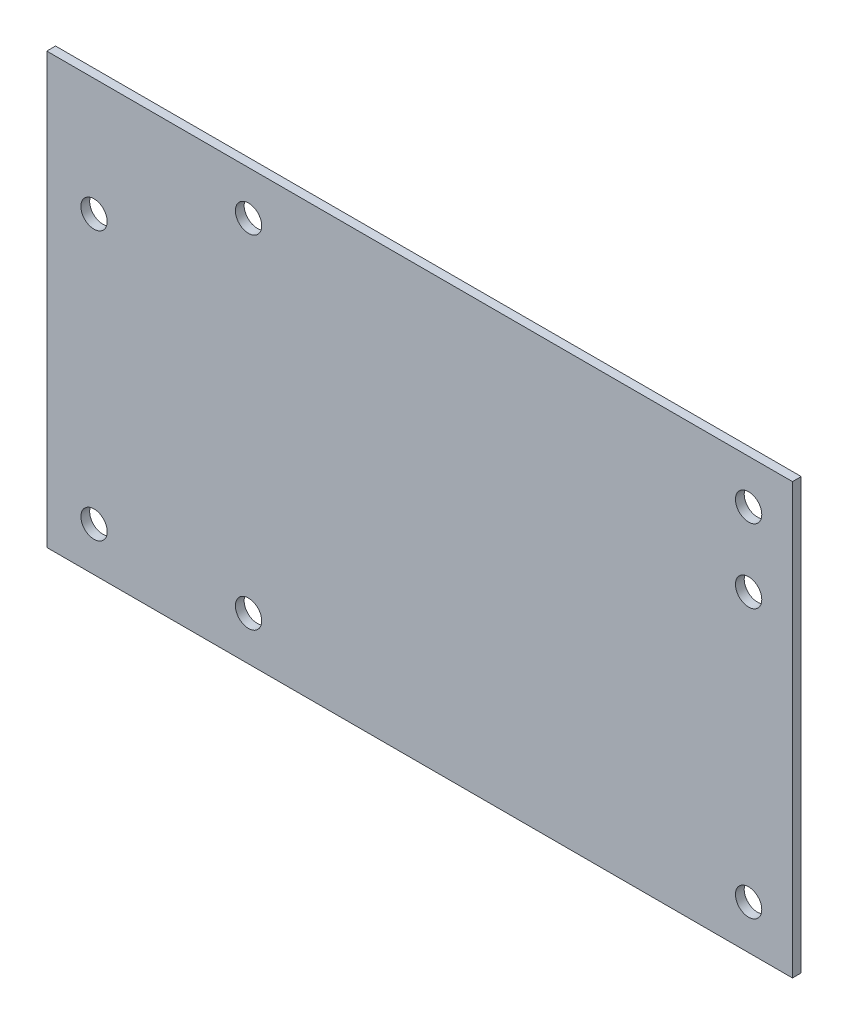
ISO-10303-21;
HEADER;
FILE_DESCRIPTION(('STEP AP214'),'2;1');
FILE_NAME('part.step','',(''),(''),'','','');
FILE_SCHEMA(('AUTOMOTIVE_DESIGN { 1 0 10303 214 1 1 1 1 }'));
ENDSEC;
DATA;
#1=APPLICATION_CONTEXT('core data for automotive mechanical design processes');
#2=APPLICATION_PROTOCOL_DEFINITION('international standard','automotive_design',2000,#1);
#3=PRODUCT_CONTEXT('',#1,'mechanical');
#4=PRODUCT('Part','Part','',(#3));
#5=PRODUCT_RELATED_PRODUCT_CATEGORY('part','',(#4));
#6=PRODUCT_DEFINITION_FORMATION('','',#4);
#7=PRODUCT_DEFINITION_CONTEXT('part definition',#1,'design');
#8=PRODUCT_DEFINITION('design','',#6,#7);
#9=PRODUCT_DEFINITION_SHAPE('','',#8);
#10=(LENGTH_UNIT() NAMED_UNIT(*) SI_UNIT(.MILLI.,.METRE.));
#11=(NAMED_UNIT(*) PLANE_ANGLE_UNIT() SI_UNIT($,.RADIAN.));
#12=(NAMED_UNIT(*) SI_UNIT($,.STERADIAN.) SOLID_ANGLE_UNIT());
#13=UNCERTAINTY_MEASURE_WITH_UNIT(LENGTH_MEASURE(1.E-05),#10,'distance_accuracy_value','');
#14=(GEOMETRIC_REPRESENTATION_CONTEXT(3) GLOBAL_UNCERTAINTY_ASSIGNED_CONTEXT((#13)) GLOBAL_UNIT_ASSIGNED_CONTEXT((#10,
#11,#12)) REPRESENTATION_CONTEXT('',''));
#15=CARTESIAN_POINT('',(0.,0.,0.));
#16=DIRECTION('',(0.,0.,1.));
#17=DIRECTION('',(1.,0.,0.));
#18=AXIS2_PLACEMENT_3D('',#15,#16,#17);
#19=CARTESIAN_POINT('',(0.,0.,1.));
#20=DIRECTION('',(0.,0.,1.));
#21=DIRECTION('',(1.,0.,0.));
#22=AXIS2_PLACEMENT_3D('',#19,#20,#21);
#23=PLANE('',#22);
#24=CARTESIAN_POINT('',(-79.61,4.99999999999998,1.));
#25=DIRECTION('',(0.,0.,1.));
#26=DIRECTION('',(1.,0.,0.));
#27=AXIS2_PLACEMENT_3D('',#24,#25,#26);
#28=CIRCLE('',#27,1.49999999999998);
#29=CARTESIAN_POINT('',(-78.11,4.99999999999998,1.));
#30=VERTEX_POINT('',#29);
#31=EDGE_CURVE('E139',#30,#30,#28,.T.);
#32=ORIENTED_EDGE('',*,*,#31,.F.);
#33=EDGE_LOOP('',(#32));
#34=FACE_BOUND('',#33,.T.);
#35=CARTESIAN_POINT('',(-79.61,35.61,1.));
#36=DIRECTION('',(0.,0.,1.));
#37=DIRECTION('',(1.,0.,0.));
#38=AXIS2_PLACEMENT_3D('',#35,#36,#37);
#39=CIRCLE('',#38,1.5);
#40=CARTESIAN_POINT('',(-78.11,35.61,1.));
#41=VERTEX_POINT('',#40);
#42=EDGE_CURVE('E127',#41,#41,#39,.T.);
#43=ORIENTED_EDGE('',*,*,#42,.F.);
#44=EDGE_LOOP('',(#43));
#45=FACE_BOUND('',#44,.T.);
#46=CARTESIAN_POINT('',(-62.,44.,1.));
#47=DIRECTION('',(0.,0.,1.));
#48=DIRECTION('',(1.,0.,0.));
#49=AXIS2_PLACEMENT_3D('',#46,#47,#48);
#50=CIRCLE('',#49,1.5);
#51=CARTESIAN_POINT('',(-60.5,44.,1.));
#52=VERTEX_POINT('',#51);
#53=EDGE_CURVE('E115',#52,#52,#50,.T.);
#54=ORIENTED_EDGE('',*,*,#53,.F.);
#55=EDGE_LOOP('',(#54));
#56=FACE_BOUND('',#55,.T.);
#57=DIRECTION('',(0.,1.,0.));
#58=VECTOR('',#57,1.);
#59=CARTESIAN_POINT('',(0.,0.,1.));
#60=LINE('',#59,#58);
#61=CARTESIAN_POINT('',(0.,0.,1.));
#62=VERTEX_POINT('',#61);
#63=CARTESIAN_POINT('',(0.,49.,1.));
#64=VERTEX_POINT('',#63);
#65=EDGE_CURVE('E85',#62,#64,#60,.T.);
#66=ORIENTED_EDGE('',*,*,#65,.T.);
#67=DIRECTION('',(-1.,0.,0.));
#68=VECTOR('',#67,1.);
#69=CARTESIAN_POINT('',(0.,49.,1.));
#70=LINE('',#69,#68);
#71=CARTESIAN_POINT('',(-85.,49.,1.));
#72=VERTEX_POINT('',#71);
#73=EDGE_CURVE('E80',#64,#72,#70,.T.);
#74=ORIENTED_EDGE('',*,*,#73,.T.);
#75=DIRECTION('',(0.,-1.,0.));
#76=VECTOR('',#75,1.);
#77=CARTESIAN_POINT('',(-85.,0.,1.));
#78=LINE('',#77,#76);
#79=CARTESIAN_POINT('',(-85.,0.,1.));
#80=VERTEX_POINT('',#79);
#81=EDGE_CURVE('E83',#72,#80,#78,.T.);
#82=ORIENTED_EDGE('',*,*,#81,.T.);
#83=DIRECTION('',(1.,0.,0.));
#84=VECTOR('',#83,1.);
#85=CARTESIAN_POINT('',(0.,0.,1.));
#86=LINE('',#85,#84);
#87=EDGE_CURVE('E50',#80,#62,#86,.T.);
#88=ORIENTED_EDGE('',*,*,#87,.T.);
#89=EDGE_LOOP('',(#66,#74,#82,#88));
#90=FACE_BOUND('',#89,.T.);
#91=CARTESIAN_POINT('',(-5.,5.,1.));
#92=DIRECTION('',(0.,0.,1.));
#93=DIRECTION('',(1.,0.,0.));
#94=AXIS2_PLACEMENT_3D('',#91,#92,#93);
#95=CIRCLE('',#94,1.5);
#96=CARTESIAN_POINT('',(-3.5,5.,1.));
#97=VERTEX_POINT('',#96);
#98=EDGE_CURVE('E100',#97,#97,#95,.T.);
#99=ORIENTED_EDGE('',*,*,#98,.F.);
#100=EDGE_LOOP('',(#99));
#101=FACE_BOUND('',#100,.T.);
#102=CARTESIAN_POINT('',(-4.99999999999998,35.61,1.));
#103=DIRECTION('',(0.,0.,1.));
#104=DIRECTION('',(1.,0.,0.));
#105=AXIS2_PLACEMENT_3D('',#102,#103,#104);
#106=CIRCLE('',#105,1.5);
#107=CARTESIAN_POINT('',(-3.49999999999998,35.61,1.));
#108=VERTEX_POINT('',#107);
#109=EDGE_CURVE('E121',#108,#108,#106,.T.);
#110=ORIENTED_EDGE('',*,*,#109,.F.);
#111=EDGE_LOOP('',(#110));
#112=FACE_BOUND('',#111,.T.);
#113=CARTESIAN_POINT('',(-62.,4.99999999999999,1.));
#114=DIRECTION('',(0.,0.,1.));
#115=DIRECTION('',(1.,0.,0.));
#116=AXIS2_PLACEMENT_3D('',#113,#114,#115);
#117=CIRCLE('',#116,1.5);
#118=CARTESIAN_POINT('',(-60.5,4.99999999999999,1.));
#119=VERTEX_POINT('',#118);
#120=EDGE_CURVE('E133',#119,#119,#117,.T.);
#121=ORIENTED_EDGE('',*,*,#120,.F.);
#122=EDGE_LOOP('',(#121));
#123=FACE_BOUND('',#122,.T.);
#124=CARTESIAN_POINT('',(-5.,44.,1.));
#125=DIRECTION('',(0.,0.,1.));
#126=DIRECTION('',(1.,0.,0.));
#127=AXIS2_PLACEMENT_3D('',#124,#125,#126);
#128=CIRCLE('',#127,1.5);
#129=CARTESIAN_POINT('',(-3.5,44.,1.));
#130=VERTEX_POINT('',#129);
#131=EDGE_CURVE('E145',#130,#130,#128,.T.);
#132=ORIENTED_EDGE('',*,*,#131,.F.);
#133=EDGE_LOOP('',(#132));
#134=FACE_BOUND('',#133,.T.);
#135=ADVANCED_FACE('F33',(#34,#45,#56,#90,#101,#112,#123,#134),#23,.T.);
#136=CARTESIAN_POINT('',(0.,0.,0.));
#137=DIRECTION('',(0.,0.,1.));
#138=DIRECTION('',(1.,0.,0.));
#139=AXIS2_PLACEMENT_3D('',#136,#137,#138);
#140=PLANE('',#139);
#141=DIRECTION('',(0.,1.,0.));
#142=VECTOR('',#141,1.);
#143=CARTESIAN_POINT('',(0.,0.,0.));
#144=LINE('',#143,#142);
#145=CARTESIAN_POINT('',(0.,0.,0.));
#146=VERTEX_POINT('',#145);
#147=CARTESIAN_POINT('',(0.,49.,0.));
#148=VERTEX_POINT('',#147);
#149=EDGE_CURVE('E97',#146,#148,#144,.T.);
#150=ORIENTED_EDGE('',*,*,#149,.F.);
#151=DIRECTION('',(1.,0.,0.));
#152=VECTOR('',#151,1.);
#153=CARTESIAN_POINT('',(0.,0.,0.));
#154=LINE('',#153,#152);
#155=CARTESIAN_POINT('',(-85.,0.,0.));
#156=VERTEX_POINT('',#155);
#157=EDGE_CURVE('E73',#156,#146,#154,.T.);
#158=ORIENTED_EDGE('',*,*,#157,.F.);
#159=DIRECTION('',(0.,-1.,0.));
#160=VECTOR('',#159,1.);
#161=CARTESIAN_POINT('',(-85.,0.,0.));
#162=LINE('',#161,#160);
#163=CARTESIAN_POINT('',(-85.,49.,0.));
#164=VERTEX_POINT('',#163);
#165=EDGE_CURVE('E67',#164,#156,#162,.T.);
#166=ORIENTED_EDGE('',*,*,#165,.F.);
#167=DIRECTION('',(-1.,0.,0.));
#168=VECTOR('',#167,1.);
#169=CARTESIAN_POINT('',(0.,49.,0.));
#170=LINE('',#169,#168);
#171=EDGE_CURVE('E89',#148,#164,#170,.T.);
#172=ORIENTED_EDGE('',*,*,#171,.F.);
#173=EDGE_LOOP('',(#150,#158,#166,#172));
#174=FACE_BOUND('',#173,.T.);
#175=CARTESIAN_POINT('',(-5.,5.,0.));
#176=DIRECTION('',(0.,0.,1.));
#177=DIRECTION('',(1.,0.,0.));
#178=AXIS2_PLACEMENT_3D('',#175,#176,#177);
#179=CIRCLE('',#178,1.5);
#180=CARTESIAN_POINT('',(-3.5,5.,0.));
#181=VERTEX_POINT('',#180);
#182=EDGE_CURVE('E112',#181,#181,#179,.T.);
#183=ORIENTED_EDGE('',*,*,#182,.T.);
#184=EDGE_LOOP('',(#183));
#185=FACE_BOUND('',#184,.T.);
#186=CARTESIAN_POINT('',(-62.,44.,0.));
#187=DIRECTION('',(0.,0.,1.));
#188=DIRECTION('',(1.,0.,0.));
#189=AXIS2_PLACEMENT_3D('',#186,#187,#188);
#190=CIRCLE('',#189,1.5);
#191=CARTESIAN_POINT('',(-60.5,44.,0.));
#192=VERTEX_POINT('',#191);
#193=EDGE_CURVE('E118',#192,#192,#190,.T.);
#194=ORIENTED_EDGE('',*,*,#193,.T.);
#195=EDGE_LOOP('',(#194));
#196=FACE_BOUND('',#195,.T.);
#197=CARTESIAN_POINT('',(-4.99999999999998,35.61,0.));
#198=DIRECTION('',(0.,0.,1.));
#199=DIRECTION('',(1.,0.,0.));
#200=AXIS2_PLACEMENT_3D('',#197,#198,#199);
#201=CIRCLE('',#200,1.5);
#202=CARTESIAN_POINT('',(-3.49999999999998,35.61,0.));
#203=VERTEX_POINT('',#202);
#204=EDGE_CURVE('E124',#203,#203,#201,.T.);
#205=ORIENTED_EDGE('',*,*,#204,.T.);
#206=EDGE_LOOP('',(#205));
#207=FACE_BOUND('',#206,.T.);
#208=CARTESIAN_POINT('',(-79.61,35.61,0.));
#209=DIRECTION('',(0.,0.,1.));
#210=DIRECTION('',(1.,0.,0.));
#211=AXIS2_PLACEMENT_3D('',#208,#209,#210);
#212=CIRCLE('',#211,1.5);
#213=CARTESIAN_POINT('',(-78.11,35.61,0.));
#214=VERTEX_POINT('',#213);
#215=EDGE_CURVE('E130',#214,#214,#212,.T.);
#216=ORIENTED_EDGE('',*,*,#215,.T.);
#217=EDGE_LOOP('',(#216));
#218=FACE_BOUND('',#217,.T.);
#219=CARTESIAN_POINT('',(-62.,4.99999999999999,0.));
#220=DIRECTION('',(0.,0.,1.));
#221=DIRECTION('',(1.,0.,0.));
#222=AXIS2_PLACEMENT_3D('',#219,#220,#221);
#223=CIRCLE('',#222,1.5);
#224=CARTESIAN_POINT('',(-60.5,4.99999999999999,0.));
#225=VERTEX_POINT('',#224);
#226=EDGE_CURVE('E136',#225,#225,#223,.T.);
#227=ORIENTED_EDGE('',*,*,#226,.T.);
#228=EDGE_LOOP('',(#227));
#229=FACE_BOUND('',#228,.T.);
#230=CARTESIAN_POINT('',(-79.61,4.99999999999998,0.));
#231=DIRECTION('',(0.,0.,1.));
#232=DIRECTION('',(1.,0.,0.));
#233=AXIS2_PLACEMENT_3D('',#230,#231,#232);
#234=CIRCLE('',#233,1.49999999999998);
#235=CARTESIAN_POINT('',(-78.11,4.99999999999998,0.));
#236=VERTEX_POINT('',#235);
#237=EDGE_CURVE('E142',#236,#236,#234,.T.);
#238=ORIENTED_EDGE('',*,*,#237,.T.);
#239=EDGE_LOOP('',(#238));
#240=FACE_BOUND('',#239,.T.);
#241=CARTESIAN_POINT('',(-5.,44.,0.));
#242=DIRECTION('',(0.,0.,1.));
#243=DIRECTION('',(1.,0.,0.));
#244=AXIS2_PLACEMENT_3D('',#241,#242,#243);
#245=CIRCLE('',#244,1.5);
#246=CARTESIAN_POINT('',(-3.5,44.,0.));
#247=VERTEX_POINT('',#246);
#248=EDGE_CURVE('E148',#247,#247,#245,.T.);
#249=ORIENTED_EDGE('',*,*,#248,.T.);
#250=EDGE_LOOP('',(#249));
#251=FACE_BOUND('',#250,.T.);
#252=ADVANCED_FACE('F108',(#174,#185,#196,#207,#218,#229,#240,#251),#140,.F.);
#253=CARTESIAN_POINT('',(0.,0.,1.));
#254=DIRECTION('',(-1.,0.,0.));
#255=DIRECTION('',(0.,0.,1.));
#256=AXIS2_PLACEMENT_3D('',#253,#254,#255);
#257=PLANE('',#256);
#258=ORIENTED_EDGE('',*,*,#149,.T.);
#259=DIRECTION('',(0.,0.,-1.));
#260=VECTOR('',#259,1.);
#261=CARTESIAN_POINT('',(0.,49.,1.));
#262=LINE('',#261,#260);
#263=EDGE_CURVE('E11',#64,#148,#262,.T.);
#264=ORIENTED_EDGE('',*,*,#263,.F.);
#265=ORIENTED_EDGE('',*,*,#65,.F.);
#266=DIRECTION('',(0.,0.,-1.));
#267=VECTOR('',#266,1.);
#268=CARTESIAN_POINT('',(0.,0.,1.));
#269=LINE('',#268,#267);
#270=EDGE_CURVE('E93',#62,#146,#269,.T.);
#271=ORIENTED_EDGE('',*,*,#270,.T.);
#272=EDGE_LOOP('',(#258,#264,#265,#271));
#273=FACE_BOUND('',#272,.T.);
#274=ADVANCED_FACE('F35',(#273),#257,.F.);
#275=CARTESIAN_POINT('',(0.,49.,1.));
#276=DIRECTION('',(0.,-1.,0.));
#277=DIRECTION('',(1.,0.,0.));
#278=AXIS2_PLACEMENT_3D('',#275,#276,#277);
#279=PLANE('',#278);
#280=ORIENTED_EDGE('',*,*,#171,.T.);
#281=DIRECTION('',(0.,0.,-1.));
#282=VECTOR('',#281,1.);
#283=CARTESIAN_POINT('',(-85.,49.,1.));
#284=LINE('',#283,#282);
#285=EDGE_CURVE('E42',#72,#164,#284,.T.);
#286=ORIENTED_EDGE('',*,*,#285,.F.);
#287=ORIENTED_EDGE('',*,*,#73,.F.);
#288=ORIENTED_EDGE('',*,*,#263,.T.);
#289=EDGE_LOOP('',(#280,#286,#287,#288));
#290=FACE_BOUND('',#289,.T.);
#291=ADVANCED_FACE('F88',(#290),#279,.F.);
#292=CARTESIAN_POINT('',(-85.,0.,1.));
#293=DIRECTION('',(1.,0.,0.));
#294=DIRECTION('',(0.,0.,-1.));
#295=AXIS2_PLACEMENT_3D('',#292,#293,#294);
#296=PLANE('',#295);
#297=ORIENTED_EDGE('',*,*,#165,.T.);
#298=DIRECTION('',(0.,0.,-1.));
#299=VECTOR('',#298,1.);
#300=CARTESIAN_POINT('',(-85.,0.,1.));
#301=LINE('',#300,#299);
#302=EDGE_CURVE('E90',#80,#156,#301,.T.);
#303=ORIENTED_EDGE('',*,*,#302,.F.);
#304=ORIENTED_EDGE('',*,*,#81,.F.);
#305=ORIENTED_EDGE('',*,*,#285,.T.);
#306=EDGE_LOOP('',(#297,#303,#304,#305));
#307=FACE_BOUND('',#306,.T.);
#308=ADVANCED_FACE('F91',(#307),#296,.F.);
#309=CARTESIAN_POINT('',(0.,0.,1.));
#310=DIRECTION('',(0.,1.,0.));
#311=DIRECTION('',(-1.,0.,0.));
#312=AXIS2_PLACEMENT_3D('',#309,#310,#311);
#313=PLANE('',#312);
#314=ORIENTED_EDGE('',*,*,#157,.T.);
#315=ORIENTED_EDGE('',*,*,#270,.F.);
#316=ORIENTED_EDGE('',*,*,#87,.F.);
#317=ORIENTED_EDGE('',*,*,#302,.T.);
#318=EDGE_LOOP('',(#314,#315,#316,#317));
#319=FACE_BOUND('',#318,.T.);
#320=ADVANCED_FACE('F105',(#319),#313,.F.);
#321=CARTESIAN_POINT('',(-5.,5.,1.));
#322=DIRECTION('',(0.,0.,-1.));
#323=DIRECTION('',(-1.,0.,0.));
#324=AXIS2_PLACEMENT_3D('',#321,#322,#323);
#325=CYLINDRICAL_SURFACE('',#324,1.5);
#326=ORIENTED_EDGE('',*,*,#98,.T.);
#327=EDGE_LOOP('',(#326));
#328=FACE_BOUND('',#327,.T.);
#329=ORIENTED_EDGE('',*,*,#182,.F.);
#330=EDGE_LOOP('',(#329));
#331=FACE_BOUND('',#330,.T.);
#332=ADVANCED_FACE('F167',(#328,#331),#325,.F.);
#333=CARTESIAN_POINT('',(-62.,44.,1.));
#334=DIRECTION('',(0.,0.,-1.));
#335=DIRECTION('',(-1.,0.,0.));
#336=AXIS2_PLACEMENT_3D('',#333,#334,#335);
#337=CYLINDRICAL_SURFACE('',#336,1.5);
#338=ORIENTED_EDGE('',*,*,#53,.T.);
#339=EDGE_LOOP('',(#338));
#340=FACE_BOUND('',#339,.T.);
#341=ORIENTED_EDGE('',*,*,#193,.F.);
#342=EDGE_LOOP('',(#341));
#343=FACE_BOUND('',#342,.T.);
#344=ADVANCED_FACE('F213',(#340,#343),#337,.F.);
#345=CARTESIAN_POINT('',(-4.99999999999998,35.61,1.));
#346=DIRECTION('',(0.,0.,-1.));
#347=DIRECTION('',(-1.,0.,0.));
#348=AXIS2_PLACEMENT_3D('',#345,#346,#347);
#349=CYLINDRICAL_SURFACE('',#348,1.5);
#350=ORIENTED_EDGE('',*,*,#109,.T.);
#351=EDGE_LOOP('',(#350));
#352=FACE_BOUND('',#351,.T.);
#353=ORIENTED_EDGE('',*,*,#204,.F.);
#354=EDGE_LOOP('',(#353));
#355=FACE_BOUND('',#354,.T.);
#356=ADVANCED_FACE('F221',(#352,#355),#349,.F.);
#357=CARTESIAN_POINT('',(-79.61,35.61,1.));
#358=DIRECTION('',(0.,0.,-1.));
#359=DIRECTION('',(-1.,0.,0.));
#360=AXIS2_PLACEMENT_3D('',#357,#358,#359);
#361=CYLINDRICAL_SURFACE('',#360,1.5);
#362=ORIENTED_EDGE('',*,*,#42,.T.);
#363=EDGE_LOOP('',(#362));
#364=FACE_BOUND('',#363,.T.);
#365=ORIENTED_EDGE('',*,*,#215,.F.);
#366=EDGE_LOOP('',(#365));
#367=FACE_BOUND('',#366,.T.);
#368=ADVANCED_FACE('F229',(#364,#367),#361,.F.);
#369=CARTESIAN_POINT('',(-62.,4.99999999999999,1.));
#370=DIRECTION('',(0.,0.,-1.));
#371=DIRECTION('',(-1.,0.,0.));
#372=AXIS2_PLACEMENT_3D('',#369,#370,#371);
#373=CYLINDRICAL_SURFACE('',#372,1.5);
#374=ORIENTED_EDGE('',*,*,#120,.T.);
#375=EDGE_LOOP('',(#374));
#376=FACE_BOUND('',#375,.T.);
#377=ORIENTED_EDGE('',*,*,#226,.F.);
#378=EDGE_LOOP('',(#377));
#379=FACE_BOUND('',#378,.T.);
#380=ADVANCED_FACE('F238',(#376,#379),#373,.F.);
#381=CARTESIAN_POINT('',(-79.61,4.99999999999998,1.));
#382=DIRECTION('',(0.,0.,-1.));
#383=DIRECTION('',(-1.,0.,0.));
#384=AXIS2_PLACEMENT_3D('',#381,#382,#383);
#385=CYLINDRICAL_SURFACE('',#384,1.49999999999998);
#386=ORIENTED_EDGE('',*,*,#31,.T.);
#387=EDGE_LOOP('',(#386));
#388=FACE_BOUND('',#387,.T.);
#389=ORIENTED_EDGE('',*,*,#237,.F.);
#390=EDGE_LOOP('',(#389));
#391=FACE_BOUND('',#390,.T.);
#392=ADVANCED_FACE('F247',(#388,#391),#385,.F.);
#393=CARTESIAN_POINT('',(-5.,44.,1.));
#394=DIRECTION('',(0.,0.,-1.));
#395=DIRECTION('',(-1.,0.,0.));
#396=AXIS2_PLACEMENT_3D('',#393,#394,#395);
#397=CYLINDRICAL_SURFACE('',#396,1.5);
#398=ORIENTED_EDGE('',*,*,#131,.T.);
#399=EDGE_LOOP('',(#398));
#400=FACE_BOUND('',#399,.T.);
#401=ORIENTED_EDGE('',*,*,#248,.F.);
#402=EDGE_LOOP('',(#401));
#403=FACE_BOUND('',#402,.T.);
#404=ADVANCED_FACE('F154',(#400,#403),#397,.F.);
#405=CLOSED_SHELL('',(#135,#252,#274,#291,#308,#320,#332,#344,#356,#368,#380,#392,#404));
#406=MANIFOLD_SOLID_BREP('B2',#405);
#407=ADVANCED_BREP_SHAPE_REPRESENTATION('',(#18,#406),#14);
#408=SHAPE_DEFINITION_REPRESENTATION(#9,#407);
ENDSEC;
END-ISO-10303-21;
